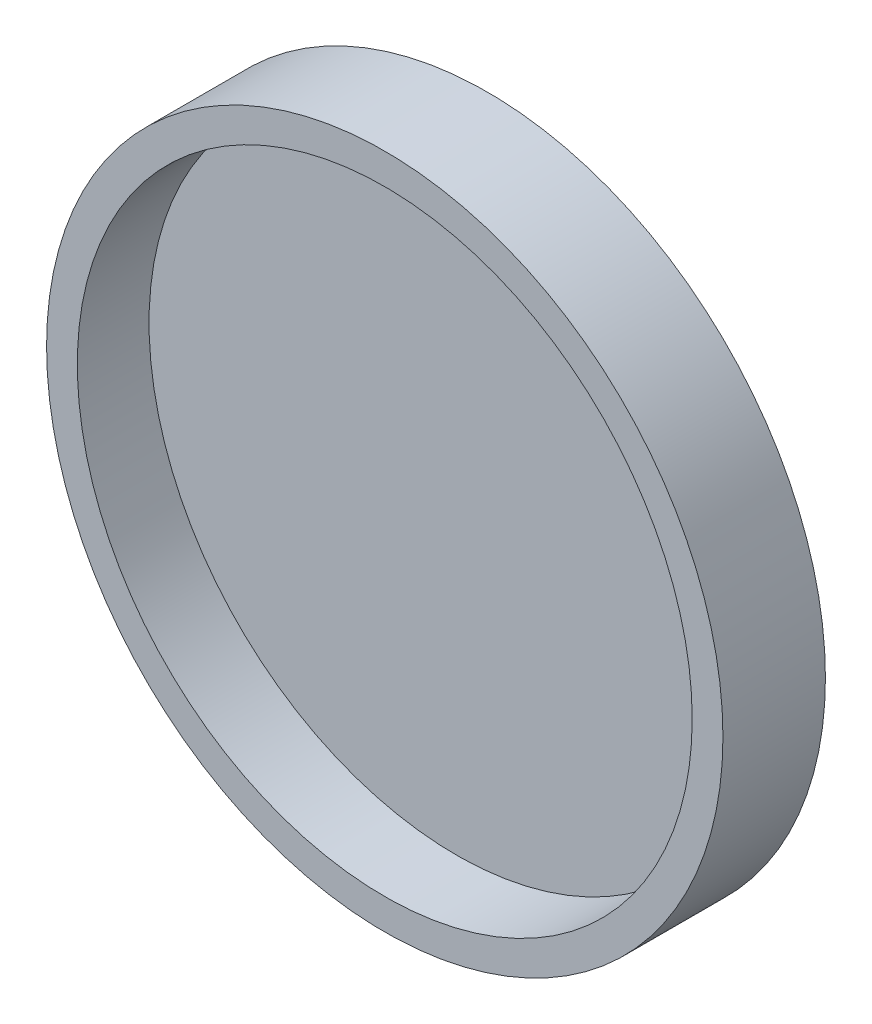
ISO-10303-21;
HEADER;
FILE_DESCRIPTION(('STEP AP214'),'2;1');
FILE_NAME('part.step','',(''),(''),'','','');
FILE_SCHEMA(('AUTOMOTIVE_DESIGN { 1 0 10303 214 1 1 1 1 }'));
ENDSEC;
DATA;
#1=APPLICATION_CONTEXT('core data for automotive mechanical design processes');
#2=APPLICATION_PROTOCOL_DEFINITION('international standard','automotive_design',2000,#1);
#3=PRODUCT_CONTEXT('',#1,'mechanical');
#4=PRODUCT('Part','Part','',(#3));
#5=PRODUCT_RELATED_PRODUCT_CATEGORY('part','',(#4));
#6=PRODUCT_DEFINITION_FORMATION('','',#4);
#7=PRODUCT_DEFINITION_CONTEXT('part definition',#1,'design');
#8=PRODUCT_DEFINITION('design','',#6,#7);
#9=PRODUCT_DEFINITION_SHAPE('','',#8);
#10=(LENGTH_UNIT() NAMED_UNIT(*) SI_UNIT(.MILLI.,.METRE.));
#11=(NAMED_UNIT(*) PLANE_ANGLE_UNIT() SI_UNIT($,.RADIAN.));
#12=(NAMED_UNIT(*) SI_UNIT($,.STERADIAN.) SOLID_ANGLE_UNIT());
#13=UNCERTAINTY_MEASURE_WITH_UNIT(LENGTH_MEASURE(1.E-05),#10,'distance_accuracy_value','');
#14=(GEOMETRIC_REPRESENTATION_CONTEXT(3) GLOBAL_UNCERTAINTY_ASSIGNED_CONTEXT((#13)) GLOBAL_UNIT_ASSIGNED_CONTEXT((#10,
#11,#12)) REPRESENTATION_CONTEXT('',''));
#15=CARTESIAN_POINT('',(0.,0.,0.));
#16=DIRECTION('',(0.,0.,1.));
#17=DIRECTION('',(1.,0.,0.));
#18=AXIS2_PLACEMENT_3D('',#15,#16,#17);
#19=CARTESIAN_POINT('',(0.,0.,10.));
#20=DIRECTION('',(0.,0.,-1.));
#21=DIRECTION('',(-1.,0.,0.));
#22=AXIS2_PLACEMENT_3D('',#19,#20,#21);
#23=CYLINDRICAL_SURFACE('',#22,33.);
#24=CARTESIAN_POINT('',(0.,0.,10.));
#25=DIRECTION('',(0.,0.,1.));
#26=DIRECTION('',(1.,0.,0.));
#27=AXIS2_PLACEMENT_3D('',#24,#25,#26);
#28=CIRCLE('',#27,33.);
#29=CARTESIAN_POINT('',(33.,0.,10.));
#30=VERTEX_POINT('',#29);
#31=EDGE_CURVE('E10',#30,#30,#28,.T.);
#32=ORIENTED_EDGE('',*,*,#31,.F.);
#33=EDGE_LOOP('',(#32));
#34=FACE_BOUND('',#33,.T.);
#35=CARTESIAN_POINT('',(0.,0.,0.));
#36=DIRECTION('',(0.,0.,1.));
#37=DIRECTION('',(1.,0.,0.));
#38=AXIS2_PLACEMENT_3D('',#35,#36,#37);
#39=CIRCLE('',#38,33.);
#40=CARTESIAN_POINT('',(33.,0.,0.));
#41=VERTEX_POINT('',#40);
#42=EDGE_CURVE('E38',#41,#41,#39,.T.);
#43=ORIENTED_EDGE('',*,*,#42,.T.);
#44=EDGE_LOOP('',(#43));
#45=FACE_BOUND('',#44,.T.);
#46=ADVANCED_FACE('F35',(#34,#45),#23,.T.);
#47=CARTESIAN_POINT('',(0.,0.,10.));
#48=DIRECTION('',(0.,0.,1.));
#49=DIRECTION('',(1.,0.,0.));
#50=AXIS2_PLACEMENT_3D('',#47,#48,#49);
#51=PLANE('',#50);
#52=CARTESIAN_POINT('',(0.,0.,10.));
#53=DIRECTION('',(0.,0.,1.));
#54=DIRECTION('',(1.,0.,0.));
#55=AXIS2_PLACEMENT_3D('',#52,#53,#54);
#56=CIRCLE('',#55,30.);
#57=CARTESIAN_POINT('',(30.,0.,10.));
#58=VERTEX_POINT('',#57);
#59=EDGE_CURVE('E45',#58,#58,#56,.T.);
#60=ORIENTED_EDGE('',*,*,#59,.F.);
#61=EDGE_LOOP('',(#60));
#62=FACE_BOUND('',#61,.T.);
#63=ORIENTED_EDGE('',*,*,#31,.T.);
#64=EDGE_LOOP('',(#63));
#65=FACE_BOUND('',#64,.T.);
#66=ADVANCED_FACE('F65',(#62,#65),#51,.T.);
#67=CARTESIAN_POINT('',(0.,0.,0.));
#68=DIRECTION('',(0.,0.,1.));
#69=DIRECTION('',(1.,0.,0.));
#70=AXIS2_PLACEMENT_3D('',#67,#68,#69);
#71=PLANE('',#70);
#72=ORIENTED_EDGE('',*,*,#42,.F.);
#73=EDGE_LOOP('',(#72));
#74=FACE_BOUND('',#73,.T.);
#75=ADVANCED_FACE('F57',(#74),#71,.F.);
#76=CARTESIAN_POINT('',(0.,0.,10.));
#77=DIRECTION('',(0.,0.,-1.));
#78=DIRECTION('',(-1.,0.,0.));
#79=AXIS2_PLACEMENT_3D('',#76,#77,#78);
#80=CYLINDRICAL_SURFACE('',#79,30.);
#81=ORIENTED_EDGE('',*,*,#59,.T.);
#82=EDGE_LOOP('',(#81));
#83=FACE_BOUND('',#82,.T.);
#84=CARTESIAN_POINT('',(0.,0.,3.));
#85=DIRECTION('',(0.,0.,1.));
#86=DIRECTION('',(1.,0.,0.));
#87=AXIS2_PLACEMENT_3D('',#84,#85,#86);
#88=CIRCLE('',#87,30.);
#89=CARTESIAN_POINT('',(30.,0.,3.));
#90=VERTEX_POINT('',#89);
#91=EDGE_CURVE('E49',#90,#90,#88,.T.);
#92=ORIENTED_EDGE('',*,*,#91,.F.);
#93=EDGE_LOOP('',(#92));
#94=FACE_BOUND('',#93,.T.);
#95=ADVANCED_FACE('F55',(#83,#94),#80,.F.);
#96=CARTESIAN_POINT('',(0.,0.,3.));
#97=DIRECTION('',(0.,0.,1.));
#98=DIRECTION('',(1.,0.,0.));
#99=AXIS2_PLACEMENT_3D('',#96,#97,#98);
#100=PLANE('',#99);
#101=ORIENTED_EDGE('',*,*,#91,.T.);
#102=EDGE_LOOP('',(#101));
#103=FACE_BOUND('',#102,.T.);
#104=ADVANCED_FACE('F53',(#103),#100,.T.);
#105=CLOSED_SHELL('',(#46,#66,#75,#95,#104));
#106=MANIFOLD_SOLID_BREP('B2',#105);
#107=ADVANCED_BREP_SHAPE_REPRESENTATION('',(#18,#106),#14);
#108=SHAPE_DEFINITION_REPRESENTATION(#9,#107);
ENDSEC;
END-ISO-10303-21;
